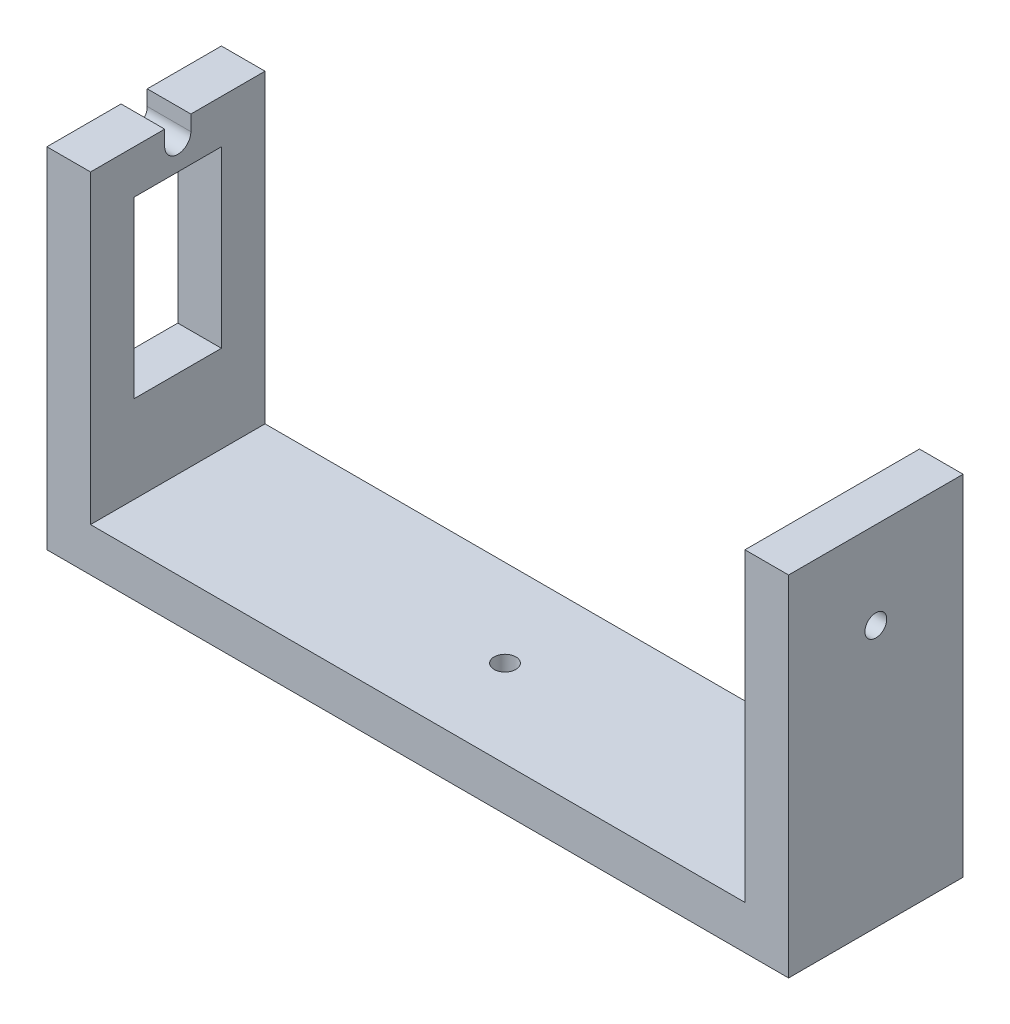
ISO-10303-21;
HEADER;
FILE_DESCRIPTION(('STEP AP214'),'2;1');
FILE_NAME('part.step','',(''),(''),'','','');
FILE_SCHEMA(('AUTOMOTIVE_DESIGN { 1 0 10303 214 1 1 1 1 }'));
ENDSEC;
DATA;
#1=APPLICATION_CONTEXT('core data for automotive mechanical design processes');
#2=APPLICATION_PROTOCOL_DEFINITION('international standard','automotive_design',2000,#1);
#3=PRODUCT_CONTEXT('',#1,'mechanical');
#4=PRODUCT('Part','Part','',(#3));
#5=PRODUCT_RELATED_PRODUCT_CATEGORY('part','',(#4));
#6=PRODUCT_DEFINITION_FORMATION('','',#4);
#7=PRODUCT_DEFINITION_CONTEXT('part definition',#1,'design');
#8=PRODUCT_DEFINITION('design','',#6,#7);
#9=PRODUCT_DEFINITION_SHAPE('','',#8);
#10=(LENGTH_UNIT() NAMED_UNIT(*) SI_UNIT(.MILLI.,.METRE.));
#11=(NAMED_UNIT(*) PLANE_ANGLE_UNIT() SI_UNIT($,.RADIAN.));
#12=(NAMED_UNIT(*) SI_UNIT($,.STERADIAN.) SOLID_ANGLE_UNIT());
#13=UNCERTAINTY_MEASURE_WITH_UNIT(LENGTH_MEASURE(1.E-05),#10,'distance_accuracy_value','');
#14=(GEOMETRIC_REPRESENTATION_CONTEXT(3) GLOBAL_UNCERTAINTY_ASSIGNED_CONTEXT((#13)) GLOBAL_UNIT_ASSIGNED_CONTEXT((#10,
#11,#12)) REPRESENTATION_CONTEXT('',''));
#15=CARTESIAN_POINT('',(0.,0.,0.));
#16=DIRECTION('',(0.,0.,1.));
#17=DIRECTION('',(1.,0.,0.));
#18=AXIS2_PLACEMENT_3D('',#15,#16,#17);
#19=CARTESIAN_POINT('',(0.,80.,0.));
#20=DIRECTION('',(0.,1.,0.));
#21=DIRECTION('',(0.,0.,1.));
#22=AXIS2_PLACEMENT_3D('',#19,#20,#21);
#23=PLANE('',#22);
#24=DIRECTION('',(1.,0.,0.));
#25=VECTOR('',#24,1.);
#26=CARTESIAN_POINT('',(0.,80.,3.));
#27=LINE('',#26,#25);
#28=CARTESIAN_POINT('',(-85.,80.,3.));
#29=VERTEX_POINT('',#28);
#30=CARTESIAN_POINT('',(-75.,80.,3.));
#31=VERTEX_POINT('',#30);
#32=EDGE_CURVE('E269',#29,#31,#27,.T.);
#33=ORIENTED_EDGE('',*,*,#32,.F.);
#34=DIRECTION('',(0.,0.,1.));
#35=VECTOR('',#34,1.);
#36=CARTESIAN_POINT('',(-85.,80.,-20.));
#37=LINE('',#36,#35);
#38=CARTESIAN_POINT('',(-85.,80.,20.));
#39=VERTEX_POINT('',#38);
#40=EDGE_CURVE('E200',#29,#39,#37,.T.);
#41=ORIENTED_EDGE('',*,*,#40,.T.);
#42=DIRECTION('',(1.,0.,0.));
#43=VECTOR('',#42,1.);
#44=CARTESIAN_POINT('',(-85.,80.,20.));
#45=LINE('',#44,#43);
#46=CARTESIAN_POINT('',(-75.,80.,20.));
#47=VERTEX_POINT('',#46);
#48=EDGE_CURVE('E199',#39,#47,#45,.T.);
#49=ORIENTED_EDGE('',*,*,#48,.T.);
#50=DIRECTION('',(0.,0.,-1.));
#51=VECTOR('',#50,1.);
#52=CARTESIAN_POINT('',(-75.,80.,-20.));
#53=LINE('',#52,#51);
#54=EDGE_CURVE('E203',#47,#31,#53,.T.);
#55=ORIENTED_EDGE('',*,*,#54,.T.);
#56=EDGE_LOOP('',(#33,#41,#49,#55));
#57=FACE_BOUND('',#56,.T.);
#58=ADVANCED_FACE('F35',(#57),#23,.T.);
#59=CARTESIAN_POINT('',(0.,10.,0.));
#60=DIRECTION('',(0.,-1.,0.));
#61=DIRECTION('',(0.,0.,-1.));
#62=AXIS2_PLACEMENT_3D('',#59,#60,#61);
#63=PLANE('',#62);
#64=CARTESIAN_POINT('',(0.,10.,0.));
#65=DIRECTION('',(0.,1.,0.));
#66=DIRECTION('',(0.,0.,1.));
#67=AXIS2_PLACEMENT_3D('',#64,#65,#66);
#68=CIRCLE('',#67,2.5);
#69=CARTESIAN_POINT('',(0.,10.,2.5));
#70=VERTEX_POINT('',#69);
#71=EDGE_CURVE('E237',#70,#70,#68,.T.);
#72=ORIENTED_EDGE('',*,*,#71,.F.);
#73=EDGE_LOOP('',(#72));
#74=FACE_BOUND('',#73,.T.);
#75=DIRECTION('',(0.,0.,-1.));
#76=VECTOR('',#75,1.);
#77=CARTESIAN_POINT('',(-75.,10.,-20.));
#78=LINE('',#77,#76);
#79=CARTESIAN_POINT('',(-75.,10.,20.));
#80=VERTEX_POINT('',#79);
#81=CARTESIAN_POINT('',(-75.,10.,-20.));
#82=VERTEX_POINT('',#81);
#83=EDGE_CURVE('E195',#80,#82,#78,.T.);
#84=ORIENTED_EDGE('',*,*,#83,.F.);
#85=DIRECTION('',(1.,0.,0.));
#86=VECTOR('',#85,1.);
#87=CARTESIAN_POINT('',(-85.,10.,20.));
#88=LINE('',#87,#86);
#89=CARTESIAN_POINT('',(75.,10.,20.));
#90=VERTEX_POINT('',#89);
#91=EDGE_CURVE('E245',#80,#90,#88,.T.);
#92=ORIENTED_EDGE('',*,*,#91,.T.);
#93=DIRECTION('',(0.,0.,1.));
#94=VECTOR('',#93,1.);
#95=CARTESIAN_POINT('',(75.,10.,-20.));
#96=LINE('',#95,#94);
#97=CARTESIAN_POINT('',(75.0000000000001,10.,-20.));
#98=VERTEX_POINT('',#97);
#99=EDGE_CURVE('E217',#98,#90,#96,.T.);
#100=ORIENTED_EDGE('',*,*,#99,.F.);
#101=DIRECTION('',(-1.,0.,0.));
#102=VECTOR('',#101,1.);
#103=CARTESIAN_POINT('',(-85.,10.,-20.));
#104=LINE('',#103,#102);
#105=EDGE_CURVE('E243',#98,#82,#104,.T.);
#106=ORIENTED_EDGE('',*,*,#105,.T.);
#107=EDGE_LOOP('',(#84,#92,#100,#106));
#108=FACE_BOUND('',#107,.T.);
#109=ADVANCED_FACE('F299',(#74,#108),#63,.F.);
#110=CARTESIAN_POINT('',(0.,0.,0.));
#111=DIRECTION('',(0.,-1.,0.));
#112=DIRECTION('',(0.,0.,-1.));
#113=AXIS2_PLACEMENT_3D('',#110,#111,#112);
#114=PLANE('',#113);
#115=DIRECTION('',(0.,0.,-1.));
#116=VECTOR('',#115,1.);
#117=CARTESIAN_POINT('',(85.,0.,20.));
#118=LINE('',#117,#116);
#119=CARTESIAN_POINT('',(85.,0.,20.));
#120=VERTEX_POINT('',#119);
#121=CARTESIAN_POINT('',(85.,0.,-20.));
#122=VERTEX_POINT('',#121);
#123=EDGE_CURVE('E240',#120,#122,#118,.T.);
#124=ORIENTED_EDGE('',*,*,#123,.F.);
#125=DIRECTION('',(1.,0.,0.));
#126=VECTOR('',#125,1.);
#127=CARTESIAN_POINT('',(-85.,0.,20.));
#128=LINE('',#127,#126);
#129=CARTESIAN_POINT('',(-85.,0.,20.));
#130=VERTEX_POINT('',#129);
#131=EDGE_CURVE('E246',#130,#120,#128,.T.);
#132=ORIENTED_EDGE('',*,*,#131,.F.);
#133=DIRECTION('',(0.,0.,1.));
#134=VECTOR('',#133,1.);
#135=CARTESIAN_POINT('',(-85.,0.,20.));
#136=LINE('',#135,#134);
#137=CARTESIAN_POINT('',(-85.,0.,-20.));
#138=VERTEX_POINT('',#137);
#139=EDGE_CURVE('E253',#138,#130,#136,.T.);
#140=ORIENTED_EDGE('',*,*,#139,.F.);
#141=DIRECTION('',(-1.,0.,0.));
#142=VECTOR('',#141,1.);
#143=CARTESIAN_POINT('',(-85.,0.,-20.));
#144=LINE('',#143,#142);
#145=EDGE_CURVE('E251',#122,#138,#144,.T.);
#146=ORIENTED_EDGE('',*,*,#145,.F.);
#147=EDGE_LOOP('',(#124,#132,#140,#146));
#148=FACE_BOUND('',#147,.T.);
#149=CARTESIAN_POINT('',(0.,0.,0.));
#150=DIRECTION('',(0.,1.,0.));
#151=DIRECTION('',(0.,0.,1.));
#152=AXIS2_PLACEMENT_3D('',#149,#150,#151);
#153=CIRCLE('',#152,2.5);
#154=CARTESIAN_POINT('',(0.,0.,2.5));
#155=VERTEX_POINT('',#154);
#156=EDGE_CURVE('E236',#155,#155,#153,.T.);
#157=ORIENTED_EDGE('',*,*,#156,.T.);
#158=EDGE_LOOP('',(#157));
#159=FACE_BOUND('',#158,.T.);
#160=ADVANCED_FACE('F306',(#148,#159),#114,.T.);
#161=CARTESIAN_POINT('',(85.,10.,20.));
#162=DIRECTION('',(-1.,0.,0.));
#163=DIRECTION('',(0.,0.,1.));
#164=AXIS2_PLACEMENT_3D('',#161,#162,#163);
#165=PLANE('',#164);
#166=CARTESIAN_POINT('',(85.,60.,0.));
#167=DIRECTION('',(1.,0.,0.));
#168=DIRECTION('',(0.,0.,-1.));
#169=AXIS2_PLACEMENT_3D('',#166,#167,#168);
#170=CIRCLE('',#169,2.5);
#171=CARTESIAN_POINT('',(85.,60.,-2.5));
#172=VERTEX_POINT('',#171);
#173=EDGE_CURVE('E437',#172,#172,#170,.T.);
#174=ORIENTED_EDGE('',*,*,#173,.F.);
#175=EDGE_LOOP('',(#174));
#176=FACE_BOUND('',#175,.T.);
#177=ORIENTED_EDGE('',*,*,#123,.T.);
#178=DIRECTION('',(0.,-1.,0.));
#179=VECTOR('',#178,1.);
#180=CARTESIAN_POINT('',(85.,10.,-20.));
#181=LINE('',#180,#179);
#182=CARTESIAN_POINT('',(85.,80.,-20.));
#183=VERTEX_POINT('',#182);
#184=EDGE_CURVE('E264',#183,#122,#181,.T.);
#185=ORIENTED_EDGE('',*,*,#184,.F.);
#186=DIRECTION('',(0.,0.,-1.));
#187=VECTOR('',#186,1.);
#188=CARTESIAN_POINT('',(85.,80.,-20.));
#189=LINE('',#188,#187);
#190=CARTESIAN_POINT('',(85.,80.,20.));
#191=VERTEX_POINT('',#190);
#192=EDGE_CURVE('E218',#191,#183,#189,.T.);
#193=ORIENTED_EDGE('',*,*,#192,.F.);
#194=DIRECTION('',(0.,-1.,0.));
#195=VECTOR('',#194,1.);
#196=CARTESIAN_POINT('',(85.,10.,20.));
#197=LINE('',#196,#195);
#198=EDGE_CURVE('E248',#191,#120,#197,.T.);
#199=ORIENTED_EDGE('',*,*,#198,.T.);
#200=EDGE_LOOP('',(#177,#185,#193,#199));
#201=FACE_BOUND('',#200,.T.);
#202=ADVANCED_FACE('F37',(#176,#201),#165,.F.);
#203=CARTESIAN_POINT('',(-85.,10.,-20.));
#204=DIRECTION('',(0.,0.,1.));
#205=DIRECTION('',(1.,0.,0.));
#206=AXIS2_PLACEMENT_3D('',#203,#204,#205);
#207=PLANE('',#206);
#208=ORIENTED_EDGE('',*,*,#145,.T.);
#209=DIRECTION('',(0.,-1.,0.));
#210=VECTOR('',#209,1.);
#211=CARTESIAN_POINT('',(-85.,10.,-20.));
#212=LINE('',#211,#210);
#213=CARTESIAN_POINT('',(-85.,80.,-20.));
#214=VERTEX_POINT('',#213);
#215=EDGE_CURVE('E261',#214,#138,#212,.T.);
#216=ORIENTED_EDGE('',*,*,#215,.F.);
#217=DIRECTION('',(-1.,0.,0.));
#218=VECTOR('',#217,1.);
#219=CARTESIAN_POINT('',(-85.,80.,-20.));
#220=LINE('',#219,#218);
#221=CARTESIAN_POINT('',(-75.,80.,-20.));
#222=VERTEX_POINT('',#221);
#223=EDGE_CURVE('E206',#222,#214,#220,.T.);
#224=ORIENTED_EDGE('',*,*,#223,.F.);
#225=DIRECTION('',(0.,-1.,0.));
#226=VECTOR('',#225,1.);
#227=CARTESIAN_POINT('',(-75.,80.,-20.));
#228=LINE('',#227,#226);
#229=EDGE_CURVE('E209',#222,#82,#228,.T.);
#230=ORIENTED_EDGE('',*,*,#229,.T.);
#231=ORIENTED_EDGE('',*,*,#105,.F.);
#232=DIRECTION('',(0.,-1.,0.));
#233=VECTOR('',#232,1.);
#234=CARTESIAN_POINT('',(75.,80.,-20.));
#235=LINE('',#234,#233);
#236=CARTESIAN_POINT('',(75.,80.,-20.));
#237=VERTEX_POINT('',#236);
#238=EDGE_CURVE('E233',#237,#98,#235,.T.);
#239=ORIENTED_EDGE('',*,*,#238,.F.);
#240=DIRECTION('',(-1.,0.,0.));
#241=VECTOR('',#240,1.);
#242=CARTESIAN_POINT('',(85.,80.,-20.));
#243=LINE('',#242,#241);
#244=EDGE_CURVE('E221',#183,#237,#243,.T.);
#245=ORIENTED_EDGE('',*,*,#244,.F.);
#246=ORIENTED_EDGE('',*,*,#184,.T.);
#247=EDGE_LOOP('',(#208,#216,#224,#230,#231,#239,#245,#246));
#248=FACE_BOUND('',#247,.T.);
#249=ADVANCED_FACE('F330',(#248),#207,.F.);
#250=CARTESIAN_POINT('',(-85.,10.,20.));
#251=DIRECTION('',(1.,0.,0.));
#252=DIRECTION('',(0.,0.,-1.));
#253=AXIS2_PLACEMENT_3D('',#250,#251,#252);
#254=PLANE('',#253);
#255=DIRECTION('',(0.,0.,-1.));
#256=VECTOR('',#255,1.);
#257=CARTESIAN_POINT('',(-85.,70.,10.));
#258=LINE('',#257,#256);
#259=CARTESIAN_POINT('',(-85.,70.,10.));
#260=VERTEX_POINT('',#259);
#261=CARTESIAN_POINT('',(-85.,70.,-10.));
#262=VERTEX_POINT('',#261);
#263=EDGE_CURVE('E161',#260,#262,#258,.T.);
#264=ORIENTED_EDGE('',*,*,#263,.F.);
#265=DIRECTION('',(0.,1.,0.));
#266=VECTOR('',#265,1.);
#267=CARTESIAN_POINT('',(-85.,70.,10.));
#268=LINE('',#267,#266);
#269=CARTESIAN_POINT('',(-85.,30.,10.));
#270=VERTEX_POINT('',#269);
#271=EDGE_CURVE('E51',#270,#260,#268,.T.);
#272=ORIENTED_EDGE('',*,*,#271,.F.);
#273=DIRECTION('',(0.,0.,1.));
#274=VECTOR('',#273,1.);
#275=CARTESIAN_POINT('',(-85.,30.,10.));
#276=LINE('',#275,#274);
#277=CARTESIAN_POINT('',(-85.,30.,-10.));
#278=VERTEX_POINT('',#277);
#279=EDGE_CURVE('E168',#278,#270,#276,.T.);
#280=ORIENTED_EDGE('',*,*,#279,.F.);
#281=DIRECTION('',(0.,-1.,0.));
#282=VECTOR('',#281,1.);
#283=CARTESIAN_POINT('',(-85.,70.,-10.));
#284=LINE('',#283,#282);
#285=EDGE_CURVE('E152',#262,#278,#284,.T.);
#286=ORIENTED_EDGE('',*,*,#285,.F.);
#287=EDGE_LOOP('',(#264,#272,#280,#286));
#288=FACE_BOUND('',#287,.T.);
#289=ORIENTED_EDGE('',*,*,#40,.F.);
#290=DIRECTION('',(0.,1.,0.));
#291=VECTOR('',#290,1.);
#292=CARTESIAN_POINT('',(-85.,80.,3.));
#293=LINE('',#292,#291);
#294=CARTESIAN_POINT('',(-85.,76.5,3.));
#295=VERTEX_POINT('',#294);
#296=EDGE_CURVE('E184',#295,#29,#293,.T.);
#297=ORIENTED_EDGE('',*,*,#296,.F.);
#298=CARTESIAN_POINT('',(-85.,76.5,0.));
#299=DIRECTION('',(-1.,0.,0.));
#300=DIRECTION('',(0.,0.,1.));
#301=AXIS2_PLACEMENT_3D('',#298,#299,#300);
#302=CIRCLE('',#301,3.);
#303=CARTESIAN_POINT('',(-85.,76.5,-3.));
#304=VERTEX_POINT('',#303);
#305=EDGE_CURVE('E181',#304,#295,#302,.T.);
#306=ORIENTED_EDGE('',*,*,#305,.F.);
#307=DIRECTION('',(0.,-1.,0.));
#308=VECTOR('',#307,1.);
#309=CARTESIAN_POINT('',(-85.,80.,-3.));
#310=LINE('',#309,#308);
#311=CARTESIAN_POINT('',(-85.,80.,-3.));
#312=VERTEX_POINT('',#311);
#313=EDGE_CURVE('E178',#312,#304,#310,.T.);
#314=ORIENTED_EDGE('',*,*,#313,.F.);
#315=EDGE_CURVE('E196',#214,#312,#37,.T.);
#316=ORIENTED_EDGE('',*,*,#315,.F.);
#317=ORIENTED_EDGE('',*,*,#215,.T.);
#318=ORIENTED_EDGE('',*,*,#139,.T.);
#319=DIRECTION('',(0.,-1.,0.));
#320=VECTOR('',#319,1.);
#321=CARTESIAN_POINT('',(-85.,10.,20.));
#322=LINE('',#321,#320);
#323=EDGE_CURVE('E258',#39,#130,#322,.T.);
#324=ORIENTED_EDGE('',*,*,#323,.F.);
#325=EDGE_LOOP('',(#289,#297,#306,#314,#316,#317,#318,#324));
#326=FACE_BOUND('',#325,.T.);
#327=ADVANCED_FACE('F165',(#288,#326),#254,.F.);
#328=CARTESIAN_POINT('',(-85.,10.,20.));
#329=DIRECTION('',(0.,0.,-1.));
#330=DIRECTION('',(-1.,0.,0.));
#331=AXIS2_PLACEMENT_3D('',#328,#329,#330);
#332=PLANE('',#331);
#333=ORIENTED_EDGE('',*,*,#131,.T.);
#334=ORIENTED_EDGE('',*,*,#198,.F.);
#335=DIRECTION('',(1.,0.,0.));
#336=VECTOR('',#335,1.);
#337=CARTESIAN_POINT('',(85.,80.,20.));
#338=LINE('',#337,#336);
#339=CARTESIAN_POINT('',(75.,80.,20.));
#340=VERTEX_POINT('',#339);
#341=EDGE_CURVE('E225',#340,#191,#338,.T.);
#342=ORIENTED_EDGE('',*,*,#341,.F.);
#343=DIRECTION('',(0.,-1.,0.));
#344=VECTOR('',#343,1.);
#345=CARTESIAN_POINT('',(75.,80.,20.));
#346=LINE('',#345,#344);
#347=EDGE_CURVE('E228',#340,#90,#346,.T.);
#348=ORIENTED_EDGE('',*,*,#347,.T.);
#349=ORIENTED_EDGE('',*,*,#91,.F.);
#350=DIRECTION('',(0.,-1.,0.));
#351=VECTOR('',#350,1.);
#352=CARTESIAN_POINT('',(-75.,80.,20.));
#353=LINE('',#352,#351);
#354=EDGE_CURVE('E214',#47,#80,#353,.T.);
#355=ORIENTED_EDGE('',*,*,#354,.F.);
#356=ORIENTED_EDGE('',*,*,#48,.F.);
#357=ORIENTED_EDGE('',*,*,#323,.T.);
#358=EDGE_LOOP('',(#333,#334,#342,#348,#349,#355,#356,#357));
#359=FACE_BOUND('',#358,.T.);
#360=ADVANCED_FACE('F343',(#359),#332,.F.);
#361=CARTESIAN_POINT('',(0.,10.,0.));
#362=DIRECTION('',(0.,-1.,0.));
#363=DIRECTION('',(0.,0.,-1.));
#364=AXIS2_PLACEMENT_3D('',#361,#362,#363);
#365=CYLINDRICAL_SURFACE('',#364,2.5);
#366=ORIENTED_EDGE('',*,*,#71,.T.);
#367=EDGE_LOOP('',(#366));
#368=FACE_BOUND('',#367,.T.);
#369=ORIENTED_EDGE('',*,*,#156,.F.);
#370=EDGE_LOOP('',(#369));
#371=FACE_BOUND('',#370,.T.);
#372=ADVANCED_FACE('F418',(#368,#371),#365,.F.);
#373=CARTESIAN_POINT('',(75.,80.,-20.));
#374=DIRECTION('',(1.,0.,0.));
#375=DIRECTION('',(0.,0.,-1.));
#376=AXIS2_PLACEMENT_3D('',#373,#374,#375);
#377=PLANE('',#376);
#378=CARTESIAN_POINT('',(75.,60.,0.));
#379=DIRECTION('',(1.,0.,0.));
#380=DIRECTION('',(0.,0.,-1.));
#381=AXIS2_PLACEMENT_3D('',#378,#379,#380);
#382=CIRCLE('',#381,2.5);
#383=CARTESIAN_POINT('',(75.,60.,-2.5));
#384=VERTEX_POINT('',#383);
#385=EDGE_CURVE('E39',#384,#384,#382,.T.);
#386=ORIENTED_EDGE('',*,*,#385,.T.);
#387=EDGE_LOOP('',(#386));
#388=FACE_BOUND('',#387,.T.);
#389=ORIENTED_EDGE('',*,*,#99,.T.);
#390=ORIENTED_EDGE('',*,*,#347,.F.);
#391=DIRECTION('',(0.,0.,1.));
#392=VECTOR('',#391,1.);
#393=CARTESIAN_POINT('',(75.,80.,-20.));
#394=LINE('',#393,#392);
#395=EDGE_CURVE('E223',#237,#340,#394,.T.);
#396=ORIENTED_EDGE('',*,*,#395,.F.);
#397=ORIENTED_EDGE('',*,*,#238,.T.);
#398=EDGE_LOOP('',(#389,#390,#396,#397));
#399=FACE_BOUND('',#398,.T.);
#400=ADVANCED_FACE('F351',(#388,#399),#377,.F.);
#401=CARTESIAN_POINT('',(0.,80.,0.));
#402=DIRECTION('',(0.,-1.,0.));
#403=DIRECTION('',(0.,0.,-1.));
#404=AXIS2_PLACEMENT_3D('',#401,#402,#403);
#405=PLANE('',#404);
#406=ORIENTED_EDGE('',*,*,#192,.T.);
#407=ORIENTED_EDGE('',*,*,#244,.T.);
#408=ORIENTED_EDGE('',*,*,#395,.T.);
#409=ORIENTED_EDGE('',*,*,#341,.T.);
#410=EDGE_LOOP('',(#406,#407,#408,#409));
#411=FACE_BOUND('',#410,.T.);
#412=ADVANCED_FACE('F320',(#411),#405,.F.);
#413=CARTESIAN_POINT('',(-75.,80.,-20.));
#414=DIRECTION('',(-1.,0.,0.));
#415=DIRECTION('',(0.,0.,1.));
#416=AXIS2_PLACEMENT_3D('',#413,#414,#415);
#417=PLANE('',#416);
#418=DIRECTION('',(0.,0.,1.));
#419=VECTOR('',#418,1.);
#420=CARTESIAN_POINT('',(-75.,30.,-20.));
#421=LINE('',#420,#419);
#422=CARTESIAN_POINT('',(-75.,30.,-10.));
#423=VERTEX_POINT('',#422);
#424=CARTESIAN_POINT('',(-75.,30.,10.));
#425=VERTEX_POINT('',#424);
#426=EDGE_CURVE('E44',#423,#425,#421,.T.);
#427=ORIENTED_EDGE('',*,*,#426,.T.);
#428=DIRECTION('',(0.,1.,0.));
#429=VECTOR('',#428,1.);
#430=CARTESIAN_POINT('',(-75.,80.,10.));
#431=LINE('',#430,#429);
#432=CARTESIAN_POINT('',(-75.,70.,10.));
#433=VERTEX_POINT('',#432);
#434=EDGE_CURVE('E11',#425,#433,#431,.T.);
#435=ORIENTED_EDGE('',*,*,#434,.T.);
#436=DIRECTION('',(0.,0.,-1.));
#437=VECTOR('',#436,1.);
#438=CARTESIAN_POINT('',(-75.,70.,-20.));
#439=LINE('',#438,#437);
#440=CARTESIAN_POINT('',(-75.,70.,-10.));
#441=VERTEX_POINT('',#440);
#442=EDGE_CURVE('E274',#433,#441,#439,.T.);
#443=ORIENTED_EDGE('',*,*,#442,.T.);
#444=DIRECTION('',(0.,-1.,0.));
#445=VECTOR('',#444,1.);
#446=CARTESIAN_POINT('',(-75.,80.,-10.));
#447=LINE('',#446,#445);
#448=EDGE_CURVE('E155',#441,#423,#447,.T.);
#449=ORIENTED_EDGE('',*,*,#448,.T.);
#450=EDGE_LOOP('',(#427,#435,#443,#449));
#451=FACE_BOUND('',#450,.T.);
#452=CARTESIAN_POINT('',(-75.,76.5,0.));
#453=DIRECTION('',(-1.,0.,0.));
#454=DIRECTION('',(0.,0.,1.));
#455=AXIS2_PLACEMENT_3D('',#452,#453,#454);
#456=CIRCLE('',#455,3.);
#457=CARTESIAN_POINT('',(-75.,76.5,-3.));
#458=VERTEX_POINT('',#457);
#459=CARTESIAN_POINT('',(-75.,76.5,3.));
#460=VERTEX_POINT('',#459);
#461=EDGE_CURVE('E271',#458,#460,#456,.T.);
#462=ORIENTED_EDGE('',*,*,#461,.T.);
#463=DIRECTION('',(0.,1.,0.));
#464=VECTOR('',#463,1.);
#465=CARTESIAN_POINT('',(-75.,80.,3.));
#466=LINE('',#465,#464);
#467=EDGE_CURVE('E192',#460,#31,#466,.T.);
#468=ORIENTED_EDGE('',*,*,#467,.T.);
#469=ORIENTED_EDGE('',*,*,#54,.F.);
#470=ORIENTED_EDGE('',*,*,#354,.T.);
#471=ORIENTED_EDGE('',*,*,#83,.T.);
#472=ORIENTED_EDGE('',*,*,#229,.F.);
#473=CARTESIAN_POINT('',(-75.,80.,-3.));
#474=VERTEX_POINT('',#473);
#475=EDGE_CURVE('E202',#474,#222,#53,.T.);
#476=ORIENTED_EDGE('',*,*,#475,.F.);
#477=DIRECTION('',(0.,-1.,0.));
#478=VECTOR('',#477,1.);
#479=CARTESIAN_POINT('',(-75.,80.,-3.));
#480=LINE('',#479,#478);
#481=EDGE_CURVE('E175',#474,#458,#480,.T.);
#482=ORIENTED_EDGE('',*,*,#481,.T.);
#483=EDGE_LOOP('',(#462,#468,#469,#470,#471,#472,#476,#482));
#484=FACE_BOUND('',#483,.T.);
#485=ADVANCED_FACE('F279',(#451,#484),#417,.F.);
#486=DIRECTION('',(-1.,0.,0.));
#487=VECTOR('',#486,1.);
#488=CARTESIAN_POINT('',(0.,80.,-3.));
#489=LINE('',#488,#487);
#490=EDGE_CURVE('E267',#474,#312,#489,.T.);
#491=ORIENTED_EDGE('',*,*,#490,.F.);
#492=ORIENTED_EDGE('',*,*,#475,.T.);
#493=ORIENTED_EDGE('',*,*,#223,.T.);
#494=ORIENTED_EDGE('',*,*,#315,.T.);
#495=EDGE_LOOP('',(#491,#492,#493,#494));
#496=FACE_BOUND('',#495,.T.);
#497=ADVANCED_FACE('F302',(#496),#23,.T.);
#498=CARTESIAN_POINT('',(-35.,76.5,0.));
#499=DIRECTION('',(-1.,0.,0.));
#500=DIRECTION('',(0.,0.,1.));
#501=AXIS2_PLACEMENT_3D('',#498,#499,#500);
#502=CYLINDRICAL_SURFACE('',#501,3.);
#503=DIRECTION('',(-1.,0.,0.));
#504=VECTOR('',#503,1.);
#505=CARTESIAN_POINT('',(-35.,76.5,-3.));
#506=LINE('',#505,#504);
#507=EDGE_CURVE('E186',#458,#304,#506,.T.);
#508=ORIENTED_EDGE('',*,*,#507,.T.);
#509=ORIENTED_EDGE('',*,*,#305,.T.);
#510=DIRECTION('',(-1.,0.,0.));
#511=VECTOR('',#510,1.);
#512=CARTESIAN_POINT('',(-35.,76.5,3.));
#513=LINE('',#512,#511);
#514=EDGE_CURVE('E187',#460,#295,#513,.T.);
#515=ORIENTED_EDGE('',*,*,#514,.F.);
#516=ORIENTED_EDGE('',*,*,#461,.F.);
#517=EDGE_LOOP('',(#508,#509,#515,#516));
#518=FACE_BOUND('',#517,.T.);
#519=ADVANCED_FACE('F312',(#518),#502,.F.);
#520=CARTESIAN_POINT('',(-35.,80.,3.));
#521=DIRECTION('',(0.,0.,1.));
#522=DIRECTION('',(0.,-1.,0.));
#523=AXIS2_PLACEMENT_3D('',#520,#521,#522);
#524=PLANE('',#523);
#525=ORIENTED_EDGE('',*,*,#514,.T.);
#526=ORIENTED_EDGE('',*,*,#296,.T.);
#527=ORIENTED_EDGE('',*,*,#32,.T.);
#528=ORIENTED_EDGE('',*,*,#467,.F.);
#529=EDGE_LOOP('',(#525,#526,#527,#528));
#530=FACE_BOUND('',#529,.T.);
#531=ADVANCED_FACE('F293',(#530),#524,.F.);
#532=CARTESIAN_POINT('',(-35.,80.,-3.));
#533=DIRECTION('',(0.,0.,-1.));
#534=DIRECTION('',(0.,1.,0.));
#535=AXIS2_PLACEMENT_3D('',#532,#533,#534);
#536=PLANE('',#535);
#537=ORIENTED_EDGE('',*,*,#490,.T.);
#538=ORIENTED_EDGE('',*,*,#313,.T.);
#539=ORIENTED_EDGE('',*,*,#507,.F.);
#540=ORIENTED_EDGE('',*,*,#481,.F.);
#541=EDGE_LOOP('',(#537,#538,#539,#540));
#542=FACE_BOUND('',#541,.T.);
#543=ADVANCED_FACE('F286',(#542),#536,.F.);
#544=CARTESIAN_POINT('',(-35.,70.,10.));
#545=DIRECTION('',(0.,0.,1.));
#546=DIRECTION('',(0.,-1.,0.));
#547=AXIS2_PLACEMENT_3D('',#544,#545,#546);
#548=PLANE('',#547);
#549=DIRECTION('',(-1.,0.,0.));
#550=VECTOR('',#549,1.);
#551=CARTESIAN_POINT('',(-35.,30.,10.));
#552=LINE('',#551,#550);
#553=EDGE_CURVE('E173',#425,#270,#552,.T.);
#554=ORIENTED_EDGE('',*,*,#553,.T.);
#555=ORIENTED_EDGE('',*,*,#271,.T.);
#556=DIRECTION('',(-1.,0.,0.));
#557=VECTOR('',#556,1.);
#558=CARTESIAN_POINT('',(-35.,70.,10.));
#559=LINE('',#558,#557);
#560=EDGE_CURVE('E158',#433,#260,#559,.T.);
#561=ORIENTED_EDGE('',*,*,#560,.F.);
#562=ORIENTED_EDGE('',*,*,#434,.F.);
#563=EDGE_LOOP('',(#554,#555,#561,#562));
#564=FACE_BOUND('',#563,.T.);
#565=ADVANCED_FACE('F284',(#564),#548,.F.);
#566=CARTESIAN_POINT('',(-35.,30.,10.));
#567=DIRECTION('',(0.,-1.,0.));
#568=DIRECTION('',(0.,0.,-1.));
#569=AXIS2_PLACEMENT_3D('',#566,#567,#568);
#570=PLANE('',#569);
#571=DIRECTION('',(-1.,0.,0.));
#572=VECTOR('',#571,1.);
#573=CARTESIAN_POINT('',(-35.,30.,-10.));
#574=LINE('',#573,#572);
#575=EDGE_CURVE('E157',#423,#278,#574,.T.);
#576=ORIENTED_EDGE('',*,*,#575,.T.);
#577=ORIENTED_EDGE('',*,*,#279,.T.);
#578=ORIENTED_EDGE('',*,*,#553,.F.);
#579=ORIENTED_EDGE('',*,*,#426,.F.);
#580=EDGE_LOOP('',(#576,#577,#578,#579));
#581=FACE_BOUND('',#580,.T.);
#582=ADVANCED_FACE('F283',(#581),#570,.F.);
#583=CARTESIAN_POINT('',(-35.,70.,-10.));
#584=DIRECTION('',(0.,0.,-1.));
#585=DIRECTION('',(0.,1.,0.));
#586=AXIS2_PLACEMENT_3D('',#583,#584,#585);
#587=PLANE('',#586);
#588=DIRECTION('',(-1.,0.,0.));
#589=VECTOR('',#588,1.);
#590=CARTESIAN_POINT('',(-35.,70.,-10.));
#591=LINE('',#590,#589);
#592=EDGE_CURVE('E59',#441,#262,#591,.T.);
#593=ORIENTED_EDGE('',*,*,#592,.T.);
#594=ORIENTED_EDGE('',*,*,#285,.T.);
#595=ORIENTED_EDGE('',*,*,#575,.F.);
#596=ORIENTED_EDGE('',*,*,#448,.F.);
#597=EDGE_LOOP('',(#593,#594,#595,#596));
#598=FACE_BOUND('',#597,.T.);
#599=ADVANCED_FACE('F149',(#598),#587,.F.);
#600=CARTESIAN_POINT('',(-35.,70.,10.));
#601=DIRECTION('',(0.,1.,0.));
#602=DIRECTION('',(0.,0.,1.));
#603=AXIS2_PLACEMENT_3D('',#600,#601,#602);
#604=PLANE('',#603);
#605=ORIENTED_EDGE('',*,*,#560,.T.);
#606=ORIENTED_EDGE('',*,*,#263,.T.);
#607=ORIENTED_EDGE('',*,*,#592,.F.);
#608=ORIENTED_EDGE('',*,*,#442,.F.);
#609=EDGE_LOOP('',(#605,#606,#607,#608));
#610=FACE_BOUND('',#609,.T.);
#611=ADVANCED_FACE('F162',(#610),#604,.F.);
#612=CARTESIAN_POINT('',(61.0000000000001,60.,0.));
#613=DIRECTION('',(1.,0.,0.));
#614=DIRECTION('',(0.,0.,-1.));
#615=AXIS2_PLACEMENT_3D('',#612,#613,#614);
#616=CYLINDRICAL_SURFACE('',#615,2.5);
#617=ORIENTED_EDGE('',*,*,#173,.T.);
#618=EDGE_LOOP('',(#617));
#619=FACE_BOUND('',#618,.T.);
#620=ORIENTED_EDGE('',*,*,#385,.F.);
#621=EDGE_LOOP('',(#620));
#622=FACE_BOUND('',#621,.T.);
#623=ADVANCED_FACE('F395',(#619,#622),#616,.F.);
#624=CLOSED_SHELL('',(#58,#109,#160,#202,#249,#327,#360,#372,#400,#412,#485,#497,#519,#531,#543,
#565,#582,#599,#611,#623));
#625=MANIFOLD_SOLID_BREP('B2',#624);
#626=ADVANCED_BREP_SHAPE_REPRESENTATION('',(#18,#625),#14);
#627=SHAPE_DEFINITION_REPRESENTATION(#9,#626);
ENDSEC;
END-ISO-10303-21;
